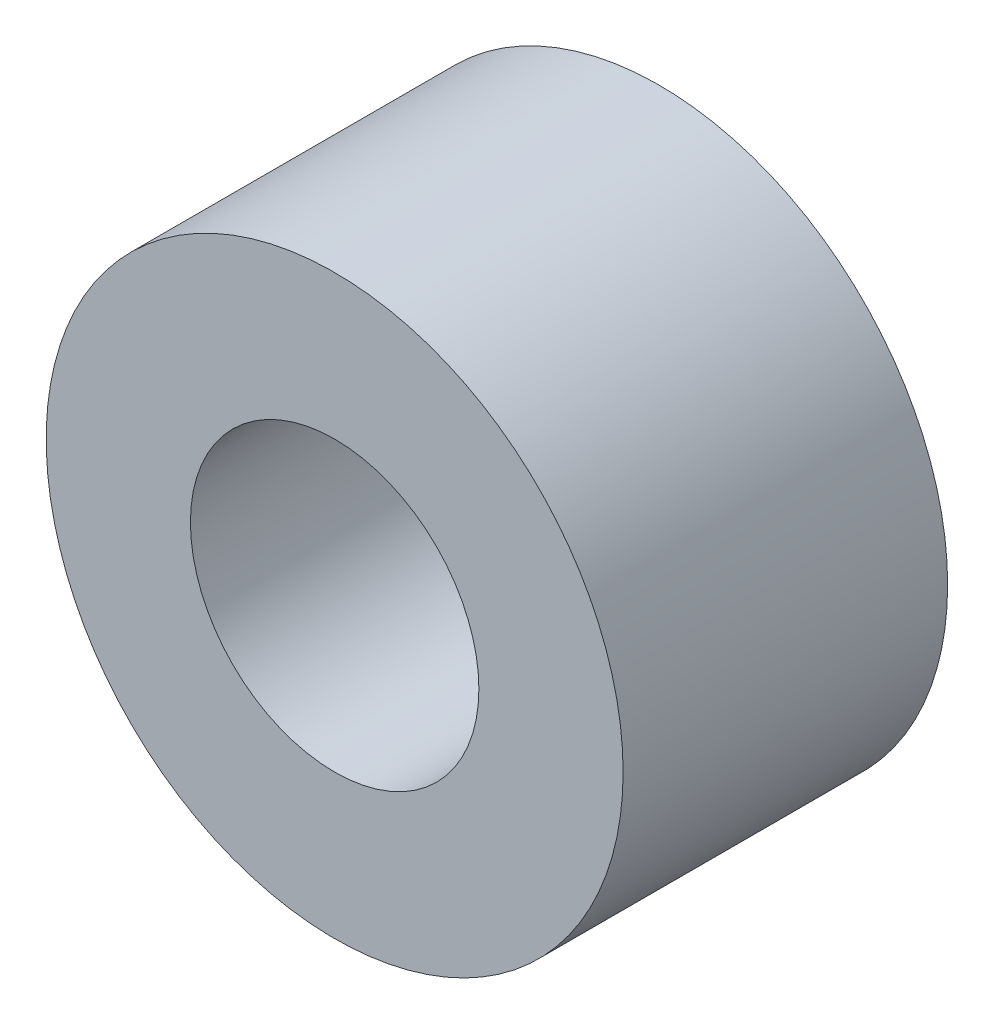
ISO-10303-21;
HEADER;
FILE_DESCRIPTION(('STEP AP214'),'2;1');
FILE_NAME('part.step','',(''),(''),'','','');
FILE_SCHEMA(('AUTOMOTIVE_DESIGN { 1 0 10303 214 1 1 1 1 }'));
ENDSEC;
DATA;
#1=APPLICATION_CONTEXT('core data for automotive mechanical design processes');
#2=APPLICATION_PROTOCOL_DEFINITION('international standard','automotive_design',2000,#1);
#3=PRODUCT_CONTEXT('',#1,'mechanical');
#4=PRODUCT('Part','Part','',(#3));
#5=PRODUCT_RELATED_PRODUCT_CATEGORY('part','',(#4));
#6=PRODUCT_DEFINITION_FORMATION('','',#4);
#7=PRODUCT_DEFINITION_CONTEXT('part definition',#1,'design');
#8=PRODUCT_DEFINITION('design','',#6,#7);
#9=PRODUCT_DEFINITION_SHAPE('','',#8);
#10=(LENGTH_UNIT() NAMED_UNIT(*) SI_UNIT(.MILLI.,.METRE.));
#11=(NAMED_UNIT(*) PLANE_ANGLE_UNIT() SI_UNIT($,.RADIAN.));
#12=(NAMED_UNIT(*) SI_UNIT($,.STERADIAN.) SOLID_ANGLE_UNIT());
#13=UNCERTAINTY_MEASURE_WITH_UNIT(LENGTH_MEASURE(1.E-05),#10,'distance_accuracy_value','');
#14=(GEOMETRIC_REPRESENTATION_CONTEXT(3) GLOBAL_UNCERTAINTY_ASSIGNED_CONTEXT((#13)) GLOBAL_UNIT_ASSIGNED_CONTEXT((#10,
#11,#12)) REPRESENTATION_CONTEXT('',''));
#15=CARTESIAN_POINT('',(0.,0.,0.));
#16=DIRECTION('',(0.,0.,1.));
#17=DIRECTION('',(1.,0.,0.));
#18=AXIS2_PLACEMENT_3D('',#15,#16,#17);
#19=CARTESIAN_POINT('',(0.,0.,7.14375));
#20=DIRECTION('',(0.,0.,-1.));
#21=DIRECTION('',(-1.,0.,0.));
#22=AXIS2_PLACEMENT_3D('',#19,#20,#21);
#23=CYLINDRICAL_SURFACE('',#22,6.35);
#24=CARTESIAN_POINT('',(0.,0.,7.14375));
#25=DIRECTION('',(0.,0.,1.));
#26=DIRECTION('',(1.,0.,0.));
#27=AXIS2_PLACEMENT_3D('',#24,#25,#26);
#28=CIRCLE('',#27,6.35);
#29=CARTESIAN_POINT('',(6.35,0.,7.14375));
#30=VERTEX_POINT('',#29);
#31=EDGE_CURVE('E10',#30,#30,#28,.T.);
#32=ORIENTED_EDGE('',*,*,#31,.F.);
#33=EDGE_LOOP('',(#32));
#34=FACE_BOUND('',#33,.T.);
#35=CARTESIAN_POINT('',(0.,0.,0.));
#36=DIRECTION('',(0.,0.,1.));
#37=DIRECTION('',(1.,0.,0.));
#38=AXIS2_PLACEMENT_3D('',#35,#36,#37);
#39=CIRCLE('',#38,6.35);
#40=CARTESIAN_POINT('',(6.35,0.,0.));
#41=VERTEX_POINT('',#40);
#42=EDGE_CURVE('E39',#41,#41,#39,.T.);
#43=ORIENTED_EDGE('',*,*,#42,.T.);
#44=EDGE_LOOP('',(#43));
#45=FACE_BOUND('',#44,.T.);
#46=ADVANCED_FACE('F36',(#34,#45),#23,.T.);
#47=CARTESIAN_POINT('',(0.,0.,7.14375));
#48=DIRECTION('',(0.,0.,1.));
#49=DIRECTION('',(1.,0.,0.));
#50=AXIS2_PLACEMENT_3D('',#47,#48,#49);
#51=PLANE('',#50);
#52=CARTESIAN_POINT('',(0.,0.,7.14375));
#53=DIRECTION('',(0.,0.,1.));
#54=DIRECTION('',(1.,0.,0.));
#55=AXIS2_PLACEMENT_3D('',#52,#53,#54);
#56=CIRCLE('',#55,3.175);
#57=CARTESIAN_POINT('',(3.175,0.,7.14375));
#58=VERTEX_POINT('',#57);
#59=EDGE_CURVE('E48',#58,#58,#56,.T.);
#60=ORIENTED_EDGE('',*,*,#59,.F.);
#61=EDGE_LOOP('',(#60));
#62=FACE_BOUND('',#61,.T.);
#63=ORIENTED_EDGE('',*,*,#31,.T.);
#64=EDGE_LOOP('',(#63));
#65=FACE_BOUND('',#64,.T.);
#66=ADVANCED_FACE('F63',(#62,#65),#51,.T.);
#67=CARTESIAN_POINT('',(0.,0.,0.));
#68=DIRECTION('',(0.,0.,1.));
#69=DIRECTION('',(1.,0.,0.));
#70=AXIS2_PLACEMENT_3D('',#67,#68,#69);
#71=PLANE('',#70);
#72=CARTESIAN_POINT('',(0.,0.,0.));
#73=DIRECTION('',(0.,0.,1.));
#74=DIRECTION('',(1.,0.,0.));
#75=AXIS2_PLACEMENT_3D('',#72,#73,#74);
#76=CIRCLE('',#75,3.175);
#77=CARTESIAN_POINT('',(3.175,0.,0.));
#78=VERTEX_POINT('',#77);
#79=EDGE_CURVE('E46',#78,#78,#76,.T.);
#80=ORIENTED_EDGE('',*,*,#79,.T.);
#81=EDGE_LOOP('',(#80));
#82=FACE_BOUND('',#81,.T.);
#83=ORIENTED_EDGE('',*,*,#42,.F.);
#84=EDGE_LOOP('',(#83));
#85=FACE_BOUND('',#84,.T.);
#86=ADVANCED_FACE('F54',(#82,#85),#71,.F.);
#87=CARTESIAN_POINT('',(0.,0.,0.));
#88=DIRECTION('',(0.,0.,1.));
#89=DIRECTION('',(1.,0.,0.));
#90=AXIS2_PLACEMENT_3D('',#87,#88,#89);
#91=CYLINDRICAL_SURFACE('',#90,3.175);
#92=ORIENTED_EDGE('',*,*,#79,.F.);
#93=EDGE_LOOP('',(#92));
#94=FACE_BOUND('',#93,.T.);
#95=ORIENTED_EDGE('',*,*,#59,.T.);
#96=EDGE_LOOP('',(#95));
#97=FACE_BOUND('',#96,.T.);
#98=ADVANCED_FACE('F57',(#94,#97),#91,.F.);
#99=CLOSED_SHELL('',(#46,#66,#86,#98));
#100=MANIFOLD_SOLID_BREP('B2',#99);
#101=ADVANCED_BREP_SHAPE_REPRESENTATION('',(#18,#100),#14);
#102=SHAPE_DEFINITION_REPRESENTATION(#9,#101);
ENDSEC;
END-ISO-10303-21;
